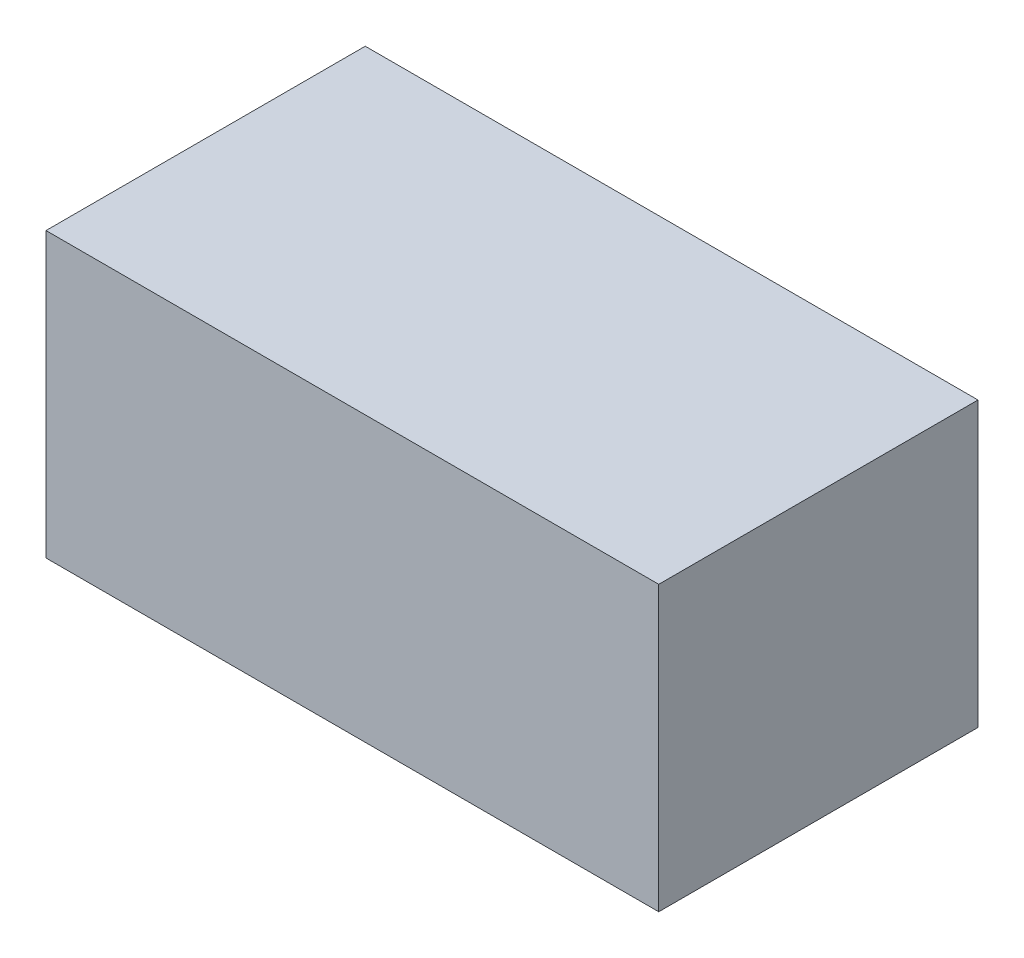
ISO-10303-21;
HEADER;
FILE_DESCRIPTION(('STEP AP214'),'2;1');
FILE_NAME('part.step','',(''),(''),'','','');
FILE_SCHEMA(('AUTOMOTIVE_DESIGN { 1 0 10303 214 1 1 1 1 }'));
ENDSEC;
DATA;
#1=APPLICATION_CONTEXT('core data for automotive mechanical design processes');
#2=APPLICATION_PROTOCOL_DEFINITION('international standard','automotive_design',2000,#1);
#3=PRODUCT_CONTEXT('',#1,'mechanical');
#4=PRODUCT('Part','Part','',(#3));
#5=PRODUCT_RELATED_PRODUCT_CATEGORY('part','',(#4));
#6=PRODUCT_DEFINITION_FORMATION('','',#4);
#7=PRODUCT_DEFINITION_CONTEXT('part definition',#1,'design');
#8=PRODUCT_DEFINITION('design','',#6,#7);
#9=PRODUCT_DEFINITION_SHAPE('','',#8);
#10=(LENGTH_UNIT() NAMED_UNIT(*) SI_UNIT(.MILLI.,.METRE.));
#11=(NAMED_UNIT(*) PLANE_ANGLE_UNIT() SI_UNIT($,.RADIAN.));
#12=(NAMED_UNIT(*) SI_UNIT($,.STERADIAN.) SOLID_ANGLE_UNIT());
#13=UNCERTAINTY_MEASURE_WITH_UNIT(LENGTH_MEASURE(1.E-05),#10,'distance_accuracy_value','');
#14=(GEOMETRIC_REPRESENTATION_CONTEXT(3) GLOBAL_UNCERTAINTY_ASSIGNED_CONTEXT((#13)) GLOBAL_UNIT_ASSIGNED_CONTEXT((#10,
#11,#12)) REPRESENTATION_CONTEXT('',''));
#15=CARTESIAN_POINT('',(0.,0.,0.));
#16=DIRECTION('',(0.,0.,1.));
#17=DIRECTION('',(1.,0.,0.));
#18=AXIS2_PLACEMENT_3D('',#15,#16,#17);
#19=CARTESIAN_POINT('',(0.,27.686,-15.5829));
#20=DIRECTION('',(1.,0.,0.));
#21=DIRECTION('',(0.,0.,-1.));
#22=AXIS2_PLACEMENT_3D('',#19,#20,#21);
#23=PLANE('',#22);
#24=DIRECTION('',(0.,0.,1.));
#25=VECTOR('',#24,1.);
#26=CARTESIAN_POINT('',(0.,0.,-15.5829));
#27=LINE('',#26,#25);
#28=CARTESIAN_POINT('',(0.,0.,-15.5829));
#29=VERTEX_POINT('',#28);
#30=CARTESIAN_POINT('',(0.,0.,15.5829));
#31=VERTEX_POINT('',#30);
#32=EDGE_CURVE('E97',#29,#31,#27,.T.);
#33=ORIENTED_EDGE('',*,*,#32,.T.);
#34=DIRECTION('',(0.,-1.,0.));
#35=VECTOR('',#34,1.);
#36=CARTESIAN_POINT('',(0.,27.686,15.5829));
#37=LINE('',#36,#35);
#38=CARTESIAN_POINT('',(0.,27.686,15.5829));
#39=VERTEX_POINT('',#38);
#40=EDGE_CURVE('E11',#39,#31,#37,.T.);
#41=ORIENTED_EDGE('',*,*,#40,.F.);
#42=DIRECTION('',(0.,0.,1.));
#43=VECTOR('',#42,1.);
#44=CARTESIAN_POINT('',(0.,27.686,-15.5829));
#45=LINE('',#44,#43);
#46=CARTESIAN_POINT('',(0.,27.686,-15.5829));
#47=VERTEX_POINT('',#46);
#48=EDGE_CURVE('E85',#47,#39,#45,.T.);
#49=ORIENTED_EDGE('',*,*,#48,.F.);
#50=DIRECTION('',(0.,-1.,0.));
#51=VECTOR('',#50,1.);
#52=CARTESIAN_POINT('',(0.,27.686,-15.5829));
#53=LINE('',#52,#51);
#54=EDGE_CURVE('E93',#47,#29,#53,.T.);
#55=ORIENTED_EDGE('',*,*,#54,.T.);
#56=EDGE_LOOP('',(#33,#41,#49,#55));
#57=FACE_BOUND('',#56,.T.);
#58=ADVANCED_FACE('F34',(#57),#23,.F.);
#59=CARTESIAN_POINT('',(0.,27.686,15.5829));
#60=DIRECTION('',(0.,0.,-1.));
#61=DIRECTION('',(-1.,0.,0.));
#62=AXIS2_PLACEMENT_3D('',#59,#60,#61);
#63=PLANE('',#62);
#64=DIRECTION('',(1.,0.,0.));
#65=VECTOR('',#64,1.);
#66=CARTESIAN_POINT('',(0.,0.,15.5829));
#67=LINE('',#66,#65);
#68=CARTESIAN_POINT('',(59.817,0.,15.5829));
#69=VERTEX_POINT('',#68);
#70=EDGE_CURVE('E89',#31,#69,#67,.T.);
#71=ORIENTED_EDGE('',*,*,#70,.T.);
#72=DIRECTION('',(0.,-1.,0.));
#73=VECTOR('',#72,1.);
#74=CARTESIAN_POINT('',(59.817,27.686,15.5829));
#75=LINE('',#74,#73);
#76=CARTESIAN_POINT('',(59.817,27.686,15.5829));
#77=VERTEX_POINT('',#76);
#78=EDGE_CURVE('E42',#77,#69,#75,.T.);
#79=ORIENTED_EDGE('',*,*,#78,.F.);
#80=DIRECTION('',(1.,0.,0.));
#81=VECTOR('',#80,1.);
#82=CARTESIAN_POINT('',(0.,27.686,15.5829));
#83=LINE('',#82,#81);
#84=EDGE_CURVE('E80',#39,#77,#83,.T.);
#85=ORIENTED_EDGE('',*,*,#84,.F.);
#86=ORIENTED_EDGE('',*,*,#40,.T.);
#87=EDGE_LOOP('',(#71,#79,#85,#86));
#88=FACE_BOUND('',#87,.T.);
#89=ADVANCED_FACE('F88',(#88),#63,.F.);
#90=CARTESIAN_POINT('',(59.817,27.686,-15.5829));
#91=DIRECTION('',(-1.,0.,0.));
#92=DIRECTION('',(0.,0.,1.));
#93=AXIS2_PLACEMENT_3D('',#90,#91,#92);
#94=PLANE('',#93);
#95=DIRECTION('',(0.,0.,-1.));
#96=VECTOR('',#95,1.);
#97=CARTESIAN_POINT('',(59.817,0.,-15.5829));
#98=LINE('',#97,#96);
#99=CARTESIAN_POINT('',(59.817,0.,-15.5829));
#100=VERTEX_POINT('',#99);
#101=EDGE_CURVE('E67',#69,#100,#98,.T.);
#102=ORIENTED_EDGE('',*,*,#101,.T.);
#103=DIRECTION('',(0.,-1.,0.));
#104=VECTOR('',#103,1.);
#105=CARTESIAN_POINT('',(59.817,27.686,-15.5829));
#106=LINE('',#105,#104);
#107=CARTESIAN_POINT('',(59.817,27.686,-15.5829));
#108=VERTEX_POINT('',#107);
#109=EDGE_CURVE('E90',#108,#100,#106,.T.);
#110=ORIENTED_EDGE('',*,*,#109,.F.);
#111=DIRECTION('',(0.,0.,-1.));
#112=VECTOR('',#111,1.);
#113=CARTESIAN_POINT('',(59.817,27.686,-15.5829));
#114=LINE('',#113,#112);
#115=EDGE_CURVE('E83',#77,#108,#114,.T.);
#116=ORIENTED_EDGE('',*,*,#115,.F.);
#117=ORIENTED_EDGE('',*,*,#78,.T.);
#118=EDGE_LOOP('',(#102,#110,#116,#117));
#119=FACE_BOUND('',#118,.T.);
#120=ADVANCED_FACE('F91',(#119),#94,.F.);
#121=CARTESIAN_POINT('',(0.,27.686,-15.5829));
#122=DIRECTION('',(0.,0.,1.));
#123=DIRECTION('',(1.,0.,0.));
#124=AXIS2_PLACEMENT_3D('',#121,#122,#123);
#125=PLANE('',#124);
#126=DIRECTION('',(-1.,0.,0.));
#127=VECTOR('',#126,1.);
#128=CARTESIAN_POINT('',(0.,0.,-15.5829));
#129=LINE('',#128,#127);
#130=EDGE_CURVE('E73',#100,#29,#129,.T.);
#131=ORIENTED_EDGE('',*,*,#130,.T.);
#132=ORIENTED_EDGE('',*,*,#54,.F.);
#133=DIRECTION('',(-1.,0.,0.));
#134=VECTOR('',#133,1.);
#135=CARTESIAN_POINT('',(0.,27.686,-15.5829));
#136=LINE('',#135,#134);
#137=EDGE_CURVE('E50',#108,#47,#136,.T.);
#138=ORIENTED_EDGE('',*,*,#137,.F.);
#139=ORIENTED_EDGE('',*,*,#109,.T.);
#140=EDGE_LOOP('',(#131,#132,#138,#139));
#141=FACE_BOUND('',#140,.T.);
#142=ADVANCED_FACE('F104',(#141),#125,.F.);
#143=CARTESIAN_POINT('',(0.,27.686,0.));
#144=DIRECTION('',(0.,1.,0.));
#145=DIRECTION('',(0.,0.,1.));
#146=AXIS2_PLACEMENT_3D('',#143,#144,#145);
#147=PLANE('',#146);
#148=ORIENTED_EDGE('',*,*,#48,.T.);
#149=ORIENTED_EDGE('',*,*,#84,.T.);
#150=ORIENTED_EDGE('',*,*,#115,.T.);
#151=ORIENTED_EDGE('',*,*,#137,.T.);
#152=EDGE_LOOP('',(#148,#149,#150,#151));
#153=FACE_BOUND('',#152,.T.);
#154=ADVANCED_FACE('F81',(#153),#147,.T.);
#155=CARTESIAN_POINT('',(0.,0.,0.));
#156=DIRECTION('',(0.,1.,0.));
#157=DIRECTION('',(0.,0.,1.));
#158=AXIS2_PLACEMENT_3D('',#155,#156,#157);
#159=PLANE('',#158);
#160=ORIENTED_EDGE('',*,*,#32,.F.);
#161=ORIENTED_EDGE('',*,*,#130,.F.);
#162=ORIENTED_EDGE('',*,*,#101,.F.);
#163=ORIENTED_EDGE('',*,*,#70,.F.);
#164=EDGE_LOOP('',(#160,#161,#162,#163));
#165=FACE_BOUND('',#164,.T.);
#166=ADVANCED_FACE('F107',(#165),#159,.F.);
#167=CLOSED_SHELL('',(#58,#89,#120,#142,#154,#166));
#168=MANIFOLD_SOLID_BREP('B2',#167);
#169=ADVANCED_BREP_SHAPE_REPRESENTATION('',(#18,#168),#14);
#170=SHAPE_DEFINITION_REPRESENTATION(#9,#169);
ENDSEC;
END-ISO-10303-21;
